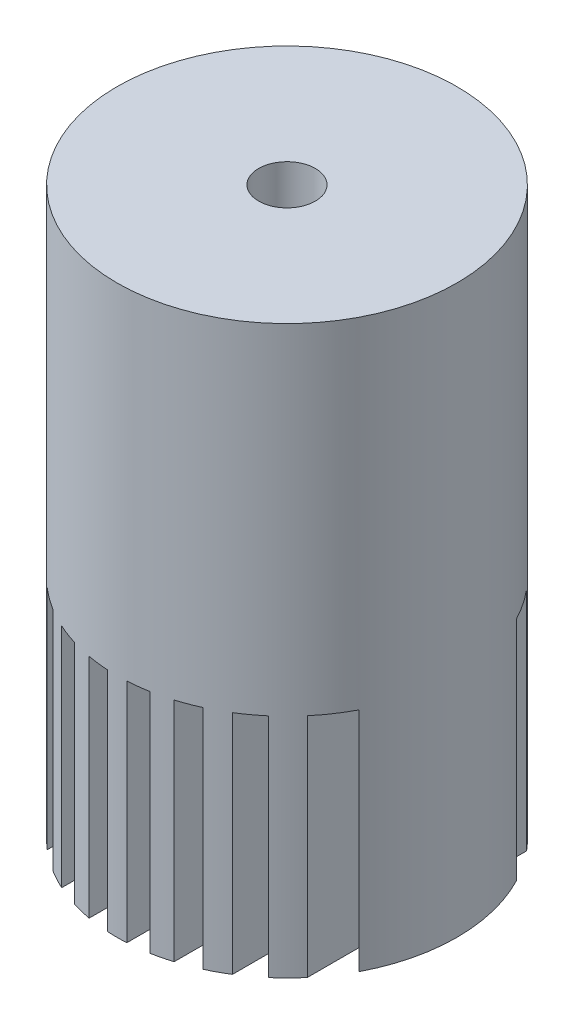
ISO-10303-21;
HEADER;
FILE_DESCRIPTION(('STEP AP214'),'2;1');
FILE_NAME('part.step','',(''),(''),'','','');
FILE_SCHEMA(('AUTOMOTIVE_DESIGN { 1 0 10303 214 1 1 1 1 }'));
ENDSEC;
DATA;
#1=APPLICATION_CONTEXT('core data for automotive mechanical design processes');
#2=APPLICATION_PROTOCOL_DEFINITION('international standard','automotive_design',2000,#1);
#3=PRODUCT_CONTEXT('',#1,'mechanical');
#4=PRODUCT('Part','Part','',(#3));
#5=PRODUCT_RELATED_PRODUCT_CATEGORY('part','',(#4));
#6=PRODUCT_DEFINITION_FORMATION('','',#4);
#7=PRODUCT_DEFINITION_CONTEXT('part definition',#1,'design');
#8=PRODUCT_DEFINITION('design','',#6,#7);
#9=PRODUCT_DEFINITION_SHAPE('','',#8);
#10=(LENGTH_UNIT() NAMED_UNIT(*) SI_UNIT(.MILLI.,.METRE.));
#11=(NAMED_UNIT(*) PLANE_ANGLE_UNIT() SI_UNIT($,.RADIAN.));
#12=(NAMED_UNIT(*) SI_UNIT($,.STERADIAN.) SOLID_ANGLE_UNIT());
#13=UNCERTAINTY_MEASURE_WITH_UNIT(LENGTH_MEASURE(1.E-05),#10,'distance_accuracy_value','');
#14=(GEOMETRIC_REPRESENTATION_CONTEXT(3) GLOBAL_UNCERTAINTY_ASSIGNED_CONTEXT((#13)) GLOBAL_UNIT_ASSIGNED_CONTEXT((#10,
#11,#12)) REPRESENTATION_CONTEXT('',''));
#15=CARTESIAN_POINT('',(0.,0.,0.));
#16=DIRECTION('',(0.,0.,1.));
#17=DIRECTION('',(1.,0.,0.));
#18=AXIS2_PLACEMENT_3D('',#15,#16,#17);
#19=CARTESIAN_POINT('',(0.,-63.5,0.));
#20=DIRECTION('',(0.,1.,0.));
#21=DIRECTION('',(0.,0.,1.));
#22=AXIS2_PLACEMENT_3D('',#19,#20,#21);
#23=PLANE('',#22);
#24=CARTESIAN_POINT('',(0.,-63.5,0.));
#25=DIRECTION('',(0.,1.,0.));
#26=DIRECTION('',(0.,0.,1.));
#27=AXIS2_PLACEMENT_3D('',#24,#25,#26);
#28=CIRCLE('',#27,38.1);
#29=CARTESIAN_POINT('',(33.782,-63.5,17.6177886240016));
#30=VERTEX_POINT('',#29);
#31=CARTESIAN_POINT('',(33.782,-63.5,-17.6177886240016));
#32=VERTEX_POINT('',#31);
#33=EDGE_CURVE('E508',#30,#32,#28,.T.);
#34=ORIENTED_EDGE('',*,*,#33,.F.);
#35=DIRECTION('',(0.,0.,-1.));
#36=VECTOR('',#35,1.);
#37=CARTESIAN_POINT('',(33.782,-63.5,0.));
#38=LINE('',#37,#36);
#39=EDGE_CURVE('E318',#30,#32,#38,.T.);
#40=ORIENTED_EDGE('',*,*,#39,.T.);
#41=EDGE_LOOP('',(#34,#40));
#42=FACE_BOUND('',#41,.T.);
#43=ADVANCED_FACE('F33',(#42),#23,.F.);
#44=CARTESIAN_POINT('',(20.12475,-63.5,-32.3512663961938));
#45=VERTEX_POINT('',#44);
#46=CARTESIAN_POINT('',(15.802,-63.5,-34.6685274564698));
#47=VERTEX_POINT('',#46);
#48=EDGE_CURVE('E513',#45,#47,#28,.T.);
#49=ORIENTED_EDGE('',*,*,#48,.F.);
#50=DIRECTION('',(0.,0.,1.));
#51=VECTOR('',#50,1.);
#52=CARTESIAN_POINT('',(20.12475,-63.5,0.));
#53=LINE('',#52,#51);
#54=CARTESIAN_POINT('',(20.12475,-63.5,32.3512663961938));
#55=VERTEX_POINT('',#54);
#56=EDGE_CURVE('E312',#45,#55,#53,.T.);
#57=ORIENTED_EDGE('',*,*,#56,.T.);
#58=CARTESIAN_POINT('',(15.802,-63.5,34.6685274564698));
#59=VERTEX_POINT('',#58);
#60=EDGE_CURVE('E504',#59,#55,#28,.T.);
#61=ORIENTED_EDGE('',*,*,#60,.F.);
#62=DIRECTION('',(0.,0.,-1.));
#63=VECTOR('',#62,1.);
#64=CARTESIAN_POINT('',(15.802,-63.5,0.));
#65=LINE('',#64,#63);
#66=EDGE_CURVE('E303',#59,#47,#65,.T.);
#67=ORIENTED_EDGE('',*,*,#66,.T.);
#68=EDGE_LOOP('',(#49,#57,#61,#67));
#69=FACE_BOUND('',#68,.T.);
#70=ADVANCED_FACE('F578',(#69),#23,.F.);
#71=CARTESIAN_POINT('',(11.13475,-63.5,-36.4366208976285));
#72=VERTEX_POINT('',#71);
#73=CARTESIAN_POINT('',(6.812,-63.5,-37.4860861654028));
#74=VERTEX_POINT('',#73);
#75=EDGE_CURVE('E516',#72,#74,#28,.T.);
#76=ORIENTED_EDGE('',*,*,#75,.F.);
#77=DIRECTION('',(0.,0.,1.));
#78=VECTOR('',#77,1.);
#79=CARTESIAN_POINT('',(11.13475,-63.5,0.));
#80=LINE('',#79,#78);
#81=CARTESIAN_POINT('',(11.13475,-63.5,36.4366208976285));
#82=VERTEX_POINT('',#81);
#83=EDGE_CURVE('E306',#72,#82,#80,.T.);
#84=ORIENTED_EDGE('',*,*,#83,.T.);
#85=CARTESIAN_POINT('',(6.812,-63.5,37.4860861654028));
#86=VERTEX_POINT('',#85);
#87=EDGE_CURVE('E277',#86,#82,#28,.T.);
#88=ORIENTED_EDGE('',*,*,#87,.F.);
#89=DIRECTION('',(0.,0.,-1.));
#90=VECTOR('',#89,1.);
#91=CARTESIAN_POINT('',(6.812,-63.5,0.));
#92=LINE('',#91,#90);
#93=EDGE_CURVE('E297',#86,#74,#92,.T.);
#94=ORIENTED_EDGE('',*,*,#93,.T.);
#95=EDGE_LOOP('',(#76,#84,#88,#94));
#96=FACE_BOUND('',#95,.T.);
#97=ADVANCED_FACE('F574',(#96),#23,.F.);
#98=CARTESIAN_POINT('',(2.14475,-63.5,-38.0395852689997));
#99=VERTEX_POINT('',#98);
#100=CARTESIAN_POINT('',(-2.178,-63.5,-38.0376959870074));
#101=VERTEX_POINT('',#100);
#102=EDGE_CURVE('E519',#99,#101,#28,.T.);
#103=ORIENTED_EDGE('',*,*,#102,.F.);
#104=DIRECTION('',(0.,0.,1.));
#105=VECTOR('',#104,1.);
#106=CARTESIAN_POINT('',(2.14475,-63.5,0.));
#107=LINE('',#106,#105);
#108=CARTESIAN_POINT('',(2.14475,-63.5,38.0395852689997));
#109=VERTEX_POINT('',#108);
#110=EDGE_CURVE('E300',#99,#109,#107,.T.);
#111=ORIENTED_EDGE('',*,*,#110,.T.);
#112=CARTESIAN_POINT('',(-2.178,-63.5,38.0376959870074));
#113=VERTEX_POINT('',#112);
#114=EDGE_CURVE('E273',#113,#109,#28,.T.);
#115=ORIENTED_EDGE('',*,*,#114,.F.);
#116=DIRECTION('',(0.,0.,-1.));
#117=VECTOR('',#116,1.);
#118=CARTESIAN_POINT('',(-2.178,-63.5,0.));
#119=LINE('',#118,#117);
#120=EDGE_CURVE('E291',#113,#101,#119,.T.);
#121=ORIENTED_EDGE('',*,*,#120,.T.);
#122=EDGE_LOOP('',(#103,#111,#115,#121));
#123=FACE_BOUND('',#122,.T.);
#124=ADVANCED_FACE('F563',(#123),#23,.F.);
#125=CARTESIAN_POINT('',(-6.84525,-63.5,-37.4800287144701));
#126=VERTEX_POINT('',#125);
#127=CARTESIAN_POINT('',(-11.168,-63.5,-36.4264433619315));
#128=VERTEX_POINT('',#127);
#129=EDGE_CURVE('E522',#126,#128,#28,.T.);
#130=ORIENTED_EDGE('',*,*,#129,.F.);
#131=DIRECTION('',(0.,0.,1.));
#132=VECTOR('',#131,1.);
#133=CARTESIAN_POINT('',(-6.84525,-63.5,0.));
#134=LINE('',#133,#132);
#135=CARTESIAN_POINT('',(-6.84525,-63.5,37.4800287144701));
#136=VERTEX_POINT('',#135);
#137=EDGE_CURVE('E294',#126,#136,#134,.T.);
#138=ORIENTED_EDGE('',*,*,#137,.T.);
#139=CARTESIAN_POINT('',(-11.168,-63.5,36.4264433619315));
#140=VERTEX_POINT('',#139);
#141=EDGE_CURVE('E272',#140,#136,#28,.T.);
#142=ORIENTED_EDGE('',*,*,#141,.F.);
#143=DIRECTION('',(0.,0.,-1.));
#144=VECTOR('',#143,1.);
#145=CARTESIAN_POINT('',(-11.168,-63.5,0.));
#146=LINE('',#145,#144);
#147=EDGE_CURVE('E285',#140,#128,#146,.T.);
#148=ORIENTED_EDGE('',*,*,#147,.T.);
#149=EDGE_LOOP('',(#130,#138,#142,#148));
#150=FACE_BOUND('',#149,.T.);
#151=ADVANCED_FACE('F551',(#150),#23,.F.);
#152=CARTESIAN_POINT('',(-15.83525,-63.5,-34.6533527589684));
#153=VERTEX_POINT('',#152);
#154=CARTESIAN_POINT('',(-20.158,-63.5,-32.3305588569081));
#155=VERTEX_POINT('',#154);
#156=EDGE_CURVE('E525',#153,#155,#28,.T.);
#157=ORIENTED_EDGE('',*,*,#156,.F.);
#158=DIRECTION('',(0.,0.,1.));
#159=VECTOR('',#158,1.);
#160=CARTESIAN_POINT('',(-15.83525,-63.5,0.));
#161=LINE('',#160,#159);
#162=CARTESIAN_POINT('',(-15.83525,-63.5,34.6533527589684));
#163=VERTEX_POINT('',#162);
#164=EDGE_CURVE('E288',#153,#163,#161,.T.);
#165=ORIENTED_EDGE('',*,*,#164,.T.);
#166=CARTESIAN_POINT('',(-20.158,-63.5,32.3305588569081));
#167=VERTEX_POINT('',#166);
#168=EDGE_CURVE('E267',#167,#163,#28,.T.);
#169=ORIENTED_EDGE('',*,*,#168,.F.);
#170=DIRECTION('',(0.,0.,-1.));
#171=VECTOR('',#170,1.);
#172=CARTESIAN_POINT('',(-20.158,-63.5,0.));
#173=LINE('',#172,#171);
#174=EDGE_CURVE('E282',#167,#155,#173,.T.);
#175=ORIENTED_EDGE('',*,*,#174,.T.);
#176=EDGE_LOOP('',(#157,#165,#169,#175));
#177=FACE_BOUND('',#176,.T.);
#178=ADVANCED_FACE('F538',(#177),#23,.F.);
#179=CARTESIAN_POINT('',(-24.82525,-63.5,-28.9018505019575));
#180=VERTEX_POINT('',#179);
#181=CARTESIAN_POINT('',(-29.148,-63.5,-24.5357717628772));
#182=VERTEX_POINT('',#181);
#183=EDGE_CURVE('E270',#180,#182,#28,.T.);
#184=ORIENTED_EDGE('',*,*,#183,.F.);
#185=DIRECTION('',(0.,0.,1.));
#186=VECTOR('',#185,1.);
#187=CARTESIAN_POINT('',(-24.82525,-63.5,0.));
#188=LINE('',#187,#186);
#189=CARTESIAN_POINT('',(-24.82525,-63.5,28.9018505019575));
#190=VERTEX_POINT('',#189);
#191=EDGE_CURVE('E265',#180,#190,#188,.T.);
#192=ORIENTED_EDGE('',*,*,#191,.T.);
#193=CARTESIAN_POINT('',(-29.148,-63.5,24.5357717628772));
#194=VERTEX_POINT('',#193);
#195=EDGE_CURVE('E258',#194,#190,#28,.T.);
#196=ORIENTED_EDGE('',*,*,#195,.F.);
#197=DIRECTION('',(0.,0.,-1.));
#198=VECTOR('',#197,1.);
#199=CARTESIAN_POINT('',(-29.148,-63.5,0.));
#200=LINE('',#199,#198);
#201=EDGE_CURVE('E240',#194,#182,#200,.T.);
#202=ORIENTED_EDGE('',*,*,#201,.T.);
#203=EDGE_LOOP('',(#184,#192,#196,#202));
#204=FACE_BOUND('',#203,.T.);
#205=ADVANCED_FACE('F264',(#204),#23,.F.);
#206=CARTESIAN_POINT('',(-33.81525,-63.5,-17.5538846822434));
#207=VERTEX_POINT('',#206);
#208=CARTESIAN_POINT('',(-33.81525,-63.5,17.5538846822434));
#209=VERTEX_POINT('',#208);
#210=EDGE_CURVE('E266',#207,#209,#28,.T.);
#211=ORIENTED_EDGE('',*,*,#210,.F.);
#212=DIRECTION('',(0.,0.,1.));
#213=VECTOR('',#212,1.);
#214=CARTESIAN_POINT('',(-33.81525,-63.5,0.));
#215=LINE('',#214,#213);
#216=EDGE_CURVE('E249',#207,#209,#215,.T.);
#217=ORIENTED_EDGE('',*,*,#216,.T.);
#218=EDGE_LOOP('',(#211,#217));
#219=FACE_BOUND('',#218,.T.);
#220=ADVANCED_FACE('F610',(#219),#23,.F.);
#221=CARTESIAN_POINT('',(0.,63.5,0.));
#222=DIRECTION('',(0.,-1.,0.));
#223=DIRECTION('',(0.,0.,-1.));
#224=AXIS2_PLACEMENT_3D('',#221,#222,#223);
#225=CYLINDRICAL_SURFACE('',#224,38.1);
#226=ORIENTED_EDGE('',*,*,#33,.T.);
#227=DIRECTION('',(0.,-1.,0.));
#228=VECTOR('',#227,1.);
#229=CARTESIAN_POINT('',(33.782,63.5,-17.6177886240016));
#230=LINE('',#229,#228);
#231=CARTESIAN_POINT('',(33.782,-12.7,-17.6177886240016));
#232=VERTEX_POINT('',#231);
#233=EDGE_CURVE('E478',#32,#232,#230,.F.);
#234=ORIENTED_EDGE('',*,*,#233,.T.);
#235=CARTESIAN_POINT('',(0.,-12.7,0.));
#236=DIRECTION('',(0.,-1.,0.));
#237=DIRECTION('',(0.,0.,-1.));
#238=AXIS2_PLACEMENT_3D('',#235,#236,#237);
#239=CIRCLE('',#238,38.1);
#240=CARTESIAN_POINT('',(29.11475,-12.7,-24.5752178512725));
#241=VERTEX_POINT('',#240);
#242=EDGE_CURVE('E11',#241,#232,#239,.T.);
#243=ORIENTED_EDGE('',*,*,#242,.F.);
#244=DIRECTION('',(0.,-1.,0.));
#245=VECTOR('',#244,1.);
#246=CARTESIAN_POINT('',(29.11475,63.5,-24.5752178512725));
#247=LINE('',#246,#245);
#248=CARTESIAN_POINT('',(29.11475,-63.5,-24.5752178512725));
#249=VERTEX_POINT('',#248);
#250=EDGE_CURVE('E475',#241,#249,#247,.T.);
#251=ORIENTED_EDGE('',*,*,#250,.T.);
#252=CARTESIAN_POINT('',(24.792,-63.5,-28.9303773912474));
#253=VERTEX_POINT('',#252);
#254=EDGE_CURVE('E510',#249,#253,#28,.T.);
#255=ORIENTED_EDGE('',*,*,#254,.T.);
#256=DIRECTION('',(0.,-1.,0.));
#257=VECTOR('',#256,1.);
#258=CARTESIAN_POINT('',(24.792,63.5,-28.9303773912474));
#259=LINE('',#258,#257);
#260=CARTESIAN_POINT('',(24.792,-12.7,-28.9303773912474));
#261=VERTEX_POINT('',#260);
#262=EDGE_CURVE('E462',#253,#261,#259,.F.);
#263=ORIENTED_EDGE('',*,*,#262,.T.);
#264=CARTESIAN_POINT('',(0.,-12.7,0.));
#265=DIRECTION('',(0.,1.,0.));
#266=DIRECTION('',(0.,0.,1.));
#267=AXIS2_PLACEMENT_3D('',#264,#265,#266);
#268=CIRCLE('',#267,38.1);
#269=CARTESIAN_POINT('',(20.12475,-12.7,-32.3512663961938));
#270=VERTEX_POINT('',#269);
#271=EDGE_CURVE('E342',#261,#270,#268,.T.);
#272=ORIENTED_EDGE('',*,*,#271,.T.);
#273=DIRECTION('',(0.,-1.,0.));
#274=VECTOR('',#273,1.);
#275=CARTESIAN_POINT('',(20.12475,63.5,-32.3512663961938));
#276=LINE('',#275,#274);
#277=EDGE_CURVE('E470',#270,#45,#276,.T.);
#278=ORIENTED_EDGE('',*,*,#277,.T.);
#279=ORIENTED_EDGE('',*,*,#48,.T.);
#280=DIRECTION('',(0.,-1.,0.));
#281=VECTOR('',#280,1.);
#282=CARTESIAN_POINT('',(15.802,63.5,-34.6685274564698));
#283=LINE('',#282,#281);
#284=CARTESIAN_POINT('',(15.802,-12.7,-34.6685274564698));
#285=VERTEX_POINT('',#284);
#286=EDGE_CURVE('E456',#47,#285,#283,.F.);
#287=ORIENTED_EDGE('',*,*,#286,.T.);
#288=CARTESIAN_POINT('',(0.,-12.7,0.));
#289=DIRECTION('',(0.,1.,0.));
#290=DIRECTION('',(0.,0.,1.));
#291=AXIS2_PLACEMENT_3D('',#288,#289,#290);
#292=CIRCLE('',#291,38.1);
#293=CARTESIAN_POINT('',(11.13475,-12.7,-36.4366208976285));
#294=VERTEX_POINT('',#293);
#295=EDGE_CURVE('E339',#285,#294,#292,.T.);
#296=ORIENTED_EDGE('',*,*,#295,.T.);
#297=DIRECTION('',(0.,-1.,0.));
#298=VECTOR('',#297,1.);
#299=CARTESIAN_POINT('',(11.13475,63.5,-36.4366208976285));
#300=LINE('',#299,#298);
#301=EDGE_CURVE('E367',#294,#72,#300,.T.);
#302=ORIENTED_EDGE('',*,*,#301,.T.);
#303=ORIENTED_EDGE('',*,*,#75,.T.);
#304=DIRECTION('',(0.,-1.,0.));
#305=VECTOR('',#304,1.);
#306=CARTESIAN_POINT('',(6.812,63.5,-37.4860861654028));
#307=LINE('',#306,#305);
#308=CARTESIAN_POINT('',(6.812,-12.7,-37.4860861654028));
#309=VERTEX_POINT('',#308);
#310=EDGE_CURVE('E444',#74,#309,#307,.F.);
#311=ORIENTED_EDGE('',*,*,#310,.T.);
#312=CARTESIAN_POINT('',(0.,-12.7,0.));
#313=DIRECTION('',(0.,1.,0.));
#314=DIRECTION('',(0.,0.,1.));
#315=AXIS2_PLACEMENT_3D('',#312,#313,#314);
#316=CIRCLE('',#315,38.1);
#317=CARTESIAN_POINT('',(2.14475,-12.7,-38.0395852689997));
#318=VERTEX_POINT('',#317);
#319=EDGE_CURVE('E335',#309,#318,#316,.T.);
#320=ORIENTED_EDGE('',*,*,#319,.T.);
#321=DIRECTION('',(0.,-1.,0.));
#322=VECTOR('',#321,1.);
#323=CARTESIAN_POINT('',(2.14475,63.5,-38.0395852689997));
#324=LINE('',#323,#322);
#325=EDGE_CURVE('E453',#318,#99,#324,.T.);
#326=ORIENTED_EDGE('',*,*,#325,.T.);
#327=ORIENTED_EDGE('',*,*,#102,.T.);
#328=DIRECTION('',(0.,-1.,0.));
#329=VECTOR('',#328,1.);
#330=CARTESIAN_POINT('',(-2.178,63.5,-38.0376959870074));
#331=LINE('',#330,#329);
#332=CARTESIAN_POINT('',(-2.178,-12.7,-38.0376959870074));
#333=VERTEX_POINT('',#332);
#334=EDGE_CURVE('E432',#101,#333,#331,.F.);
#335=ORIENTED_EDGE('',*,*,#334,.T.);
#336=CARTESIAN_POINT('',(0.,-12.7,0.));
#337=DIRECTION('',(0.,1.,0.));
#338=DIRECTION('',(0.,0.,1.));
#339=AXIS2_PLACEMENT_3D('',#336,#337,#338);
#340=CIRCLE('',#339,38.1);
#341=CARTESIAN_POINT('',(-6.84525,-12.7,-37.4800287144701));
#342=VERTEX_POINT('',#341);
#343=EDGE_CURVE('E334',#333,#342,#340,.T.);
#344=ORIENTED_EDGE('',*,*,#343,.T.);
#345=DIRECTION('',(0.,-1.,0.));
#346=VECTOR('',#345,1.);
#347=CARTESIAN_POINT('',(-6.84525,63.5,-37.4800287144701));
#348=LINE('',#347,#346);
#349=EDGE_CURVE('E441',#342,#126,#348,.T.);
#350=ORIENTED_EDGE('',*,*,#349,.T.);
#351=ORIENTED_EDGE('',*,*,#129,.T.);
#352=DIRECTION('',(0.,-1.,0.));
#353=VECTOR('',#352,1.);
#354=CARTESIAN_POINT('',(-11.168,63.5,-36.4264433619315));
#355=LINE('',#354,#353);
#356=CARTESIAN_POINT('',(-11.168,-12.7,-36.4264433619315));
#357=VERTEX_POINT('',#356);
#358=EDGE_CURVE('E420',#128,#357,#355,.F.);
#359=ORIENTED_EDGE('',*,*,#358,.T.);
#360=CARTESIAN_POINT('',(0.,-12.7,0.));
#361=DIRECTION('',(0.,1.,0.));
#362=DIRECTION('',(0.,0.,1.));
#363=AXIS2_PLACEMENT_3D('',#360,#361,#362);
#364=CIRCLE('',#363,38.1);
#365=CARTESIAN_POINT('',(-15.83525,-12.7,-34.6533527589684));
#366=VERTEX_POINT('',#365);
#367=EDGE_CURVE('E330',#357,#366,#364,.T.);
#368=ORIENTED_EDGE('',*,*,#367,.T.);
#369=DIRECTION('',(0.,-1.,0.));
#370=VECTOR('',#369,1.);
#371=CARTESIAN_POINT('',(-15.83525,63.5,-34.6533527589684));
#372=LINE('',#371,#370);
#373=EDGE_CURVE('E429',#366,#153,#372,.T.);
#374=ORIENTED_EDGE('',*,*,#373,.T.);
#375=ORIENTED_EDGE('',*,*,#156,.T.);
#376=DIRECTION('',(0.,-1.,0.));
#377=VECTOR('',#376,1.);
#378=CARTESIAN_POINT('',(-20.158,63.5,-32.3305588569081));
#379=LINE('',#378,#377);
#380=CARTESIAN_POINT('',(-20.158,-12.7,-32.3305588569081));
#381=VERTEX_POINT('',#380);
#382=EDGE_CURVE('E56',#155,#381,#379,.F.);
#383=ORIENTED_EDGE('',*,*,#382,.T.);
#384=CARTESIAN_POINT('',(0.,-12.7,0.));
#385=DIRECTION('',(0.,1.,0.));
#386=DIRECTION('',(0.,0.,1.));
#387=AXIS2_PLACEMENT_3D('',#384,#385,#386);
#388=CIRCLE('',#387,38.1);
#389=CARTESIAN_POINT('',(-24.82525,-12.7,-28.9018505019575));
#390=VERTEX_POINT('',#389);
#391=EDGE_CURVE('E326',#381,#390,#388,.T.);
#392=ORIENTED_EDGE('',*,*,#391,.T.);
#393=DIRECTION('',(0.,-1.,0.));
#394=VECTOR('',#393,1.);
#395=CARTESIAN_POINT('',(-24.82525,63.5,-28.9018505019575));
#396=LINE('',#395,#394);
#397=EDGE_CURVE('E417',#390,#180,#396,.T.);
#398=ORIENTED_EDGE('',*,*,#397,.T.);
#399=ORIENTED_EDGE('',*,*,#183,.T.);
#400=DIRECTION('',(0.,-1.,0.));
#401=VECTOR('',#400,1.);
#402=CARTESIAN_POINT('',(-29.148,63.5,-24.5357717628772));
#403=LINE('',#402,#401);
#404=CARTESIAN_POINT('',(-29.148,-12.7,-24.5357717628772));
#405=VERTEX_POINT('',#404);
#406=EDGE_CURVE('E48',#182,#405,#403,.F.);
#407=ORIENTED_EDGE('',*,*,#406,.T.);
#408=CARTESIAN_POINT('',(0.,-12.7,0.));
#409=DIRECTION('',(0.,1.,0.));
#410=DIRECTION('',(0.,0.,1.));
#411=AXIS2_PLACEMENT_3D('',#408,#409,#410);
#412=CIRCLE('',#411,38.1);
#413=CARTESIAN_POINT('',(-33.81525,-12.7,-17.5538846822434));
#414=VERTEX_POINT('',#413);
#415=EDGE_CURVE('E322',#405,#414,#412,.T.);
#416=ORIENTED_EDGE('',*,*,#415,.T.);
#417=DIRECTION('',(0.,-1.,0.));
#418=VECTOR('',#417,1.);
#419=CARTESIAN_POINT('',(-33.81525,63.5,-17.5538846822434));
#420=LINE('',#419,#418);
#421=EDGE_CURVE('E408',#414,#207,#420,.T.);
#422=ORIENTED_EDGE('',*,*,#421,.T.);
#423=ORIENTED_EDGE('',*,*,#210,.T.);
#424=DIRECTION('',(0.,-1.,0.));
#425=VECTOR('',#424,1.);
#426=CARTESIAN_POINT('',(-33.81525,63.5,17.5538846822434));
#427=LINE('',#426,#425);
#428=CARTESIAN_POINT('',(-33.81525,-12.7,17.5538846822434));
#429=VERTEX_POINT('',#428);
#430=EDGE_CURVE('E261',#209,#429,#427,.F.);
#431=ORIENTED_EDGE('',*,*,#430,.T.);
#432=CARTESIAN_POINT('',(-29.148,-12.7,24.5357717628772));
#433=VERTEX_POINT('',#432);
#434=EDGE_CURVE('E260',#429,#433,#412,.T.);
#435=ORIENTED_EDGE('',*,*,#434,.T.);
#436=DIRECTION('',(0.,-1.,0.));
#437=VECTOR('',#436,1.);
#438=CARTESIAN_POINT('',(-29.148,63.5,24.5357717628772));
#439=LINE('',#438,#437);
#440=EDGE_CURVE('E243',#433,#194,#439,.T.);
#441=ORIENTED_EDGE('',*,*,#440,.T.);
#442=ORIENTED_EDGE('',*,*,#195,.T.);
#443=DIRECTION('',(0.,-1.,0.));
#444=VECTOR('',#443,1.);
#445=CARTESIAN_POINT('',(-24.82525,63.5,28.9018505019575));
#446=LINE('',#445,#444);
#447=CARTESIAN_POINT('',(-24.82525,-12.7,28.9018505019575));
#448=VERTEX_POINT('',#447);
#449=EDGE_CURVE('E415',#190,#448,#446,.F.);
#450=ORIENTED_EDGE('',*,*,#449,.T.);
#451=CARTESIAN_POINT('',(-20.158,-12.7,32.3305588569081));
#452=VERTEX_POINT('',#451);
#453=EDGE_CURVE('E323',#448,#452,#388,.T.);
#454=ORIENTED_EDGE('',*,*,#453,.T.);
#455=DIRECTION('',(0.,-1.,0.));
#456=VECTOR('',#455,1.);
#457=CARTESIAN_POINT('',(-20.158,63.5,32.3305588569081));
#458=LINE('',#457,#456);
#459=EDGE_CURVE('E412',#452,#167,#458,.T.);
#460=ORIENTED_EDGE('',*,*,#459,.T.);
#461=ORIENTED_EDGE('',*,*,#168,.T.);
#462=DIRECTION('',(0.,-1.,0.));
#463=VECTOR('',#462,1.);
#464=CARTESIAN_POINT('',(-15.83525,63.5,34.6533527589684));
#465=LINE('',#464,#463);
#466=CARTESIAN_POINT('',(-15.83525,-12.7,34.6533527589684));
#467=VERTEX_POINT('',#466);
#468=EDGE_CURVE('E426',#163,#467,#465,.F.);
#469=ORIENTED_EDGE('',*,*,#468,.T.);
#470=CARTESIAN_POINT('',(-11.168,-12.7,36.4264433619315));
#471=VERTEX_POINT('',#470);
#472=EDGE_CURVE('E327',#467,#471,#364,.T.);
#473=ORIENTED_EDGE('',*,*,#472,.T.);
#474=DIRECTION('',(0.,-1.,0.));
#475=VECTOR('',#474,1.);
#476=CARTESIAN_POINT('',(-11.168,63.5,36.4264433619315));
#477=LINE('',#476,#475);
#478=EDGE_CURVE('E423',#471,#140,#477,.T.);
#479=ORIENTED_EDGE('',*,*,#478,.T.);
#480=ORIENTED_EDGE('',*,*,#141,.T.);
#481=DIRECTION('',(0.,-1.,0.));
#482=VECTOR('',#481,1.);
#483=CARTESIAN_POINT('',(-6.84525,63.5,37.4800287144701));
#484=LINE('',#483,#482);
#485=CARTESIAN_POINT('',(-6.84525,-12.7,37.4800287144701));
#486=VERTEX_POINT('',#485);
#487=EDGE_CURVE('E438',#136,#486,#484,.F.);
#488=ORIENTED_EDGE('',*,*,#487,.T.);
#489=CARTESIAN_POINT('',(-2.178,-12.7,38.0376959870074));
#490=VERTEX_POINT('',#489);
#491=EDGE_CURVE('E331',#486,#490,#340,.T.);
#492=ORIENTED_EDGE('',*,*,#491,.T.);
#493=DIRECTION('',(0.,-1.,0.));
#494=VECTOR('',#493,1.);
#495=CARTESIAN_POINT('',(-2.178,63.5,38.0376959870074));
#496=LINE('',#495,#494);
#497=EDGE_CURVE('E435',#490,#113,#496,.T.);
#498=ORIENTED_EDGE('',*,*,#497,.T.);
#499=ORIENTED_EDGE('',*,*,#114,.T.);
#500=DIRECTION('',(0.,-1.,0.));
#501=VECTOR('',#500,1.);
#502=CARTESIAN_POINT('',(2.14475,63.5,38.0395852689997));
#503=LINE('',#502,#501);
#504=CARTESIAN_POINT('',(2.14475,-12.7,38.0395852689997));
#505=VERTEX_POINT('',#504);
#506=EDGE_CURVE('E450',#109,#505,#503,.F.);
#507=ORIENTED_EDGE('',*,*,#506,.T.);
#508=CARTESIAN_POINT('',(6.812,-12.7,37.4860861654028));
#509=VERTEX_POINT('',#508);
#510=EDGE_CURVE('E338',#505,#509,#316,.T.);
#511=ORIENTED_EDGE('',*,*,#510,.T.);
#512=DIRECTION('',(0.,-1.,0.));
#513=VECTOR('',#512,1.);
#514=CARTESIAN_POINT('',(6.812,63.5,37.4860861654028));
#515=LINE('',#514,#513);
#516=EDGE_CURVE('E447',#509,#86,#515,.T.);
#517=ORIENTED_EDGE('',*,*,#516,.T.);
#518=ORIENTED_EDGE('',*,*,#87,.T.);
#519=DIRECTION('',(0.,-1.,0.));
#520=VECTOR('',#519,1.);
#521=CARTESIAN_POINT('',(11.13475,63.5,36.4366208976285));
#522=LINE('',#521,#520);
#523=CARTESIAN_POINT('',(11.13475,-12.7,36.4366208976285));
#524=VERTEX_POINT('',#523);
#525=EDGE_CURVE('E355',#82,#524,#522,.F.);
#526=ORIENTED_EDGE('',*,*,#525,.T.);
#527=CARTESIAN_POINT('',(15.802,-12.7,34.6685274564698));
#528=VERTEX_POINT('',#527);
#529=EDGE_CURVE('E341',#524,#528,#292,.T.);
#530=ORIENTED_EDGE('',*,*,#529,.T.);
#531=DIRECTION('',(0.,-1.,0.));
#532=VECTOR('',#531,1.);
#533=CARTESIAN_POINT('',(15.802,63.5,34.6685274564698));
#534=LINE('',#533,#532);
#535=EDGE_CURVE('E352',#528,#59,#534,.T.);
#536=ORIENTED_EDGE('',*,*,#535,.T.);
#537=ORIENTED_EDGE('',*,*,#60,.T.);
#538=DIRECTION('',(0.,-1.,0.));
#539=VECTOR('',#538,1.);
#540=CARTESIAN_POINT('',(20.12475,63.5,32.3512663961938));
#541=LINE('',#540,#539);
#542=CARTESIAN_POINT('',(20.12475,-12.7,32.3512663961938));
#543=VERTEX_POINT('',#542);
#544=EDGE_CURVE('E467',#55,#543,#541,.F.);
#545=ORIENTED_EDGE('',*,*,#544,.T.);
#546=CARTESIAN_POINT('',(24.792,-12.7,28.9303773912474));
#547=VERTEX_POINT('',#546);
#548=EDGE_CURVE('E344',#543,#547,#268,.T.);
#549=ORIENTED_EDGE('',*,*,#548,.T.);
#550=DIRECTION('',(0.,-1.,0.));
#551=VECTOR('',#550,1.);
#552=CARTESIAN_POINT('',(24.792,63.5,28.9303773912474));
#553=LINE('',#552,#551);
#554=CARTESIAN_POINT('',(24.792,-63.5,28.9303773912474));
#555=VERTEX_POINT('',#554);
#556=EDGE_CURVE('E464',#547,#555,#553,.T.);
#557=ORIENTED_EDGE('',*,*,#556,.T.);
#558=CARTESIAN_POINT('',(29.11475,-63.5,24.5752178512725));
#559=VERTEX_POINT('',#558);
#560=EDGE_CURVE('E506',#555,#559,#28,.T.);
#561=ORIENTED_EDGE('',*,*,#560,.T.);
#562=DIRECTION('',(0.,-1.,0.));
#563=VECTOR('',#562,1.);
#564=CARTESIAN_POINT('',(29.11475,63.5,24.5752178512725));
#565=LINE('',#564,#563);
#566=CARTESIAN_POINT('',(29.11475,-12.7,24.5752178512725));
#567=VERTEX_POINT('',#566);
#568=EDGE_CURVE('E472',#559,#567,#565,.F.);
#569=ORIENTED_EDGE('',*,*,#568,.T.);
#570=CARTESIAN_POINT('',(33.782,-12.7,17.6177886240016));
#571=VERTEX_POINT('',#570);
#572=EDGE_CURVE('E37',#571,#567,#239,.T.);
#573=ORIENTED_EDGE('',*,*,#572,.F.);
#574=DIRECTION('',(0.,-1.,0.));
#575=VECTOR('',#574,1.);
#576=CARTESIAN_POINT('',(33.782,63.5,17.6177886240016));
#577=LINE('',#576,#575);
#578=EDGE_CURVE('E481',#571,#30,#577,.T.);
#579=ORIENTED_EDGE('',*,*,#578,.T.);
#580=EDGE_LOOP('',(#226,#234,#243,#251,#255,#263,#272,#278,#279,#287,#296,#302,#303,#311,#320,
#326,#327,#335,#344,#350,#351,#359,#368,#374,#375,#383,#392,#398,#399,#407,#416,#422,#423,#431,
#435,#441,#442,#450,#454,#460,#461,#469,#473,#479,#480,#488,#492,#498,#499,#507,#511,#517,#518,
#526,#530,#536,#537,#545,#549,#557,#561,#569,#573,#579));
#581=FACE_BOUND('',#580,.T.);
#582=CARTESIAN_POINT('',(0.,63.5,0.));
#583=DIRECTION('',(0.,1.,0.));
#584=DIRECTION('',(0.,0.,1.));
#585=AXIS2_PLACEMENT_3D('',#582,#583,#584);
#586=CIRCLE('',#585,38.1);
#587=CARTESIAN_POINT('',(0.,63.5,38.1));
#588=VERTEX_POINT('',#587);
#589=EDGE_CURVE('E250',#588,#588,#586,.T.);
#590=ORIENTED_EDGE('',*,*,#589,.F.);
#591=EDGE_LOOP('',(#590));
#592=FACE_BOUND('',#591,.T.);
#593=ADVANCED_FACE('F35',(#581,#592),#225,.T.);
#594=CARTESIAN_POINT('',(0.,63.5,0.));
#595=DIRECTION('',(0.,1.,0.));
#596=DIRECTION('',(0.,0.,1.));
#597=AXIS2_PLACEMENT_3D('',#594,#595,#596);
#598=PLANE('',#597);
#599=CARTESIAN_POINT('',(0.,63.5,0.));
#600=DIRECTION('',(0.,1.,0.));
#601=DIRECTION('',(0.,0.,1.));
#602=AXIS2_PLACEMENT_3D('',#599,#600,#601);
#603=CIRCLE('',#602,6.35);
#604=CARTESIAN_POINT('',(0.,63.5,6.35));
#605=VERTEX_POINT('',#604);
#606=EDGE_CURVE('E276',#605,#605,#603,.T.);
#607=ORIENTED_EDGE('',*,*,#606,.F.);
#608=EDGE_LOOP('',(#607));
#609=FACE_BOUND('',#608,.T.);
#610=ORIENTED_EDGE('',*,*,#589,.T.);
#611=EDGE_LOOP('',(#610));
#612=FACE_BOUND('',#611,.T.);
#613=ADVANCED_FACE('F497',(#609,#612),#598,.T.);
#614=ORIENTED_EDGE('',*,*,#254,.F.);
#615=DIRECTION('',(0.,0.,1.));
#616=VECTOR('',#615,1.);
#617=CARTESIAN_POINT('',(29.11475,-63.5,0.));
#618=LINE('',#617,#616);
#619=EDGE_CURVE('E315',#249,#559,#618,.T.);
#620=ORIENTED_EDGE('',*,*,#619,.T.);
#621=ORIENTED_EDGE('',*,*,#560,.F.);
#622=DIRECTION('',(0.,0.,-1.));
#623=VECTOR('',#622,1.);
#624=CARTESIAN_POINT('',(24.792,-63.5,0.));
#625=LINE('',#624,#623);
#626=EDGE_CURVE('E309',#555,#253,#625,.T.);
#627=ORIENTED_EDGE('',*,*,#626,.T.);
#628=EDGE_LOOP('',(#614,#620,#621,#627));
#629=FACE_BOUND('',#628,.T.);
#630=ADVANCED_FACE('F500',(#629),#23,.F.);
#631=CARTESIAN_POINT('',(0.,45.72,0.));
#632=DIRECTION('',(0.,1.,0.));
#633=DIRECTION('',(0.,0.,1.));
#634=AXIS2_PLACEMENT_3D('',#631,#632,#633);
#635=CYLINDRICAL_SURFACE('',#634,6.35);
#636=CARTESIAN_POINT('',(0.,45.72,0.));
#637=DIRECTION('',(0.,1.,0.));
#638=DIRECTION('',(0.,0.,1.));
#639=AXIS2_PLACEMENT_3D('',#636,#637,#638);
#640=CIRCLE('',#639,6.35);
#641=CARTESIAN_POINT('',(0.,45.72,6.35));
#642=VERTEX_POINT('',#641);
#643=EDGE_CURVE('E488',#642,#642,#640,.T.);
#644=ORIENTED_EDGE('',*,*,#643,.F.);
#645=EDGE_LOOP('',(#644));
#646=FACE_BOUND('',#645,.T.);
#647=ORIENTED_EDGE('',*,*,#606,.T.);
#648=EDGE_LOOP('',(#647));
#649=FACE_BOUND('',#648,.T.);
#650=ADVANCED_FACE('F495',(#646,#649),#635,.F.);
#651=CARTESIAN_POINT('',(0.,-5.07999999999999,0.));
#652=DIRECTION('',(0.,1.,0.));
#653=DIRECTION('',(0.,0.,1.));
#654=AXIS2_PLACEMENT_3D('',#651,#652,#653);
#655=CYLINDRICAL_SURFACE('',#654,25.4);
#656=CARTESIAN_POINT('',(0.,-5.07999999999999,0.));
#657=DIRECTION('',(0.,1.,0.));
#658=DIRECTION('',(0.,0.,1.));
#659=AXIS2_PLACEMENT_3D('',#656,#657,#658);
#660=CIRCLE('',#659,25.4);
#661=CARTESIAN_POINT('',(0.,-5.07999999999999,25.4));
#662=VERTEX_POINT('',#661);
#663=EDGE_CURVE('E485',#662,#662,#660,.T.);
#664=ORIENTED_EDGE('',*,*,#663,.F.);
#665=EDGE_LOOP('',(#664));
#666=FACE_BOUND('',#665,.T.);
#667=CARTESIAN_POINT('',(0.,45.72,0.));
#668=DIRECTION('',(0.,1.,0.));
#669=DIRECTION('',(0.,0.,1.));
#670=AXIS2_PLACEMENT_3D('',#667,#668,#669);
#671=CIRCLE('',#670,25.4);
#672=CARTESIAN_POINT('',(0.,45.72,25.4));
#673=VERTEX_POINT('',#672);
#674=EDGE_CURVE('E484',#673,#673,#671,.T.);
#675=ORIENTED_EDGE('',*,*,#674,.T.);
#676=EDGE_LOOP('',(#675));
#677=FACE_BOUND('',#676,.T.);
#678=ADVANCED_FACE('F614',(#666,#677),#655,.F.);
#679=CARTESIAN_POINT('',(0.,-5.07999999999999,0.));
#680=DIRECTION('',(0.,1.,0.));
#681=DIRECTION('',(0.,0.,1.));
#682=AXIS2_PLACEMENT_3D('',#679,#680,#681);
#683=PLANE('',#682);
#684=ORIENTED_EDGE('',*,*,#663,.T.);
#685=EDGE_LOOP('',(#684));
#686=FACE_BOUND('',#685,.T.);
#687=ADVANCED_FACE('F637',(#686),#683,.T.);
#688=CARTESIAN_POINT('',(0.,45.72,0.));
#689=DIRECTION('',(0.,1.,0.));
#690=DIRECTION('',(0.,0.,1.));
#691=AXIS2_PLACEMENT_3D('',#688,#689,#690);
#692=PLANE('',#691);
#693=ORIENTED_EDGE('',*,*,#643,.T.);
#694=EDGE_LOOP('',(#693));
#695=FACE_BOUND('',#694,.T.);
#696=ORIENTED_EDGE('',*,*,#674,.F.);
#697=EDGE_LOOP('',(#696));
#698=FACE_BOUND('',#697,.T.);
#699=ADVANCED_FACE('F630',(#695,#698),#692,.F.);
#700=CARTESIAN_POINT('',(0.,-12.7,0.));
#701=DIRECTION('',(0.,1.,0.));
#702=DIRECTION('',(0.,0.,1.));
#703=AXIS2_PLACEMENT_3D('',#700,#701,#702);
#704=PLANE('',#703);
#705=DIRECTION('',(0.,0.,1.));
#706=VECTOR('',#705,1.);
#707=CARTESIAN_POINT('',(-29.148,-12.7,-38.1000000000005));
#708=LINE('',#707,#706);
#709=EDGE_CURVE('E401',#405,#433,#708,.T.);
#710=ORIENTED_EDGE('',*,*,#709,.T.);
#711=ORIENTED_EDGE('',*,*,#434,.F.);
#712=DIRECTION('',(0.,0.,-1.));
#713=VECTOR('',#712,1.);
#714=CARTESIAN_POINT('',(-33.81525,-12.7,-38.1000000000005));
#715=LINE('',#714,#713);
#716=EDGE_CURVE('E398',#429,#414,#715,.T.);
#717=ORIENTED_EDGE('',*,*,#716,.T.);
#718=ORIENTED_EDGE('',*,*,#415,.F.);
#719=EDGE_LOOP('',(#710,#711,#717,#718));
#720=FACE_BOUND('',#719,.T.);
#721=ADVANCED_FACE('F628',(#720),#704,.F.);
#722=CARTESIAN_POINT('',(-33.81525,-12.7,-38.1000000000005));
#723=DIRECTION('',(-1.,0.,0.));
#724=DIRECTION('',(0.,0.,1.));
#725=AXIS2_PLACEMENT_3D('',#722,#723,#724);
#726=PLANE('',#725);
#727=ORIENTED_EDGE('',*,*,#716,.F.);
#728=ORIENTED_EDGE('',*,*,#430,.F.);
#729=ORIENTED_EDGE('',*,*,#216,.F.);
#730=ORIENTED_EDGE('',*,*,#421,.F.);
#731=EDGE_LOOP('',(#727,#728,#729,#730));
#732=FACE_BOUND('',#731,.T.);
#733=ADVANCED_FACE('F626',(#732),#726,.F.);
#734=CARTESIAN_POINT('',(-29.148,-12.7,-38.1000000000005));
#735=DIRECTION('',(1.,0.,0.));
#736=DIRECTION('',(0.,0.,-1.));
#737=AXIS2_PLACEMENT_3D('',#734,#735,#736);
#738=PLANE('',#737);
#739=ORIENTED_EDGE('',*,*,#709,.F.);
#740=ORIENTED_EDGE('',*,*,#406,.F.);
#741=ORIENTED_EDGE('',*,*,#201,.F.);
#742=ORIENTED_EDGE('',*,*,#440,.F.);
#743=EDGE_LOOP('',(#739,#740,#741,#742));
#744=FACE_BOUND('',#743,.T.);
#745=ADVANCED_FACE('F242',(#744),#738,.F.);
#746=CARTESIAN_POINT('',(0.,-12.7,0.));
#747=DIRECTION('',(0.,1.,0.));
#748=DIRECTION('',(0.,0.,1.));
#749=AXIS2_PLACEMENT_3D('',#746,#747,#748);
#750=PLANE('',#749);
#751=DIRECTION('',(0.,0.,1.));
#752=VECTOR('',#751,1.);
#753=CARTESIAN_POINT('',(-20.158,-12.7,-38.1000000000004));
#754=LINE('',#753,#752);
#755=EDGE_CURVE('E395',#381,#452,#754,.T.);
#756=ORIENTED_EDGE('',*,*,#755,.T.);
#757=ORIENTED_EDGE('',*,*,#453,.F.);
#758=DIRECTION('',(0.,0.,-1.));
#759=VECTOR('',#758,1.);
#760=CARTESIAN_POINT('',(-24.82525,-12.7,-38.1000000000004));
#761=LINE('',#760,#759);
#762=EDGE_CURVE('E392',#448,#390,#761,.T.);
#763=ORIENTED_EDGE('',*,*,#762,.T.);
#764=ORIENTED_EDGE('',*,*,#391,.F.);
#765=EDGE_LOOP('',(#756,#757,#763,#764));
#766=FACE_BOUND('',#765,.T.);
#767=ADVANCED_FACE('F535',(#766),#750,.F.);
#768=CARTESIAN_POINT('',(-24.82525,-12.7,-38.1000000000004));
#769=DIRECTION('',(-1.,0.,0.));
#770=DIRECTION('',(0.,0.,1.));
#771=AXIS2_PLACEMENT_3D('',#768,#769,#770);
#772=PLANE('',#771);
#773=ORIENTED_EDGE('',*,*,#762,.F.);
#774=ORIENTED_EDGE('',*,*,#449,.F.);
#775=ORIENTED_EDGE('',*,*,#191,.F.);
#776=ORIENTED_EDGE('',*,*,#397,.F.);
#777=EDGE_LOOP('',(#773,#774,#775,#776));
#778=FACE_BOUND('',#777,.T.);
#779=ADVANCED_FACE('F533',(#778),#772,.F.);
#780=CARTESIAN_POINT('',(-20.158,-12.7,-38.1000000000004));
#781=DIRECTION('',(1.,0.,0.));
#782=DIRECTION('',(0.,0.,-1.));
#783=AXIS2_PLACEMENT_3D('',#780,#781,#782);
#784=PLANE('',#783);
#785=ORIENTED_EDGE('',*,*,#755,.F.);
#786=ORIENTED_EDGE('',*,*,#382,.F.);
#787=ORIENTED_EDGE('',*,*,#174,.F.);
#788=ORIENTED_EDGE('',*,*,#459,.F.);
#789=EDGE_LOOP('',(#785,#786,#787,#788));
#790=FACE_BOUND('',#789,.T.);
#791=ADVANCED_FACE('F641',(#790),#784,.F.);
#792=CARTESIAN_POINT('',(0.,-12.7,0.));
#793=DIRECTION('',(0.,1.,0.));
#794=DIRECTION('',(0.,0.,1.));
#795=AXIS2_PLACEMENT_3D('',#792,#793,#794);
#796=PLANE('',#795);
#797=DIRECTION('',(0.,0.,1.));
#798=VECTOR('',#797,1.);
#799=CARTESIAN_POINT('',(-11.168,-12.7,-38.1000000000003));
#800=LINE('',#799,#798);
#801=EDGE_CURVE('E389',#357,#471,#800,.T.);
#802=ORIENTED_EDGE('',*,*,#801,.T.);
#803=ORIENTED_EDGE('',*,*,#472,.F.);
#804=DIRECTION('',(0.,0.,-1.));
#805=VECTOR('',#804,1.);
#806=CARTESIAN_POINT('',(-15.83525,-12.7,-38.1000000000003));
#807=LINE('',#806,#805);
#808=EDGE_CURVE('E386',#467,#366,#807,.T.);
#809=ORIENTED_EDGE('',*,*,#808,.T.);
#810=ORIENTED_EDGE('',*,*,#367,.F.);
#811=EDGE_LOOP('',(#802,#803,#809,#810));
#812=FACE_BOUND('',#811,.T.);
#813=ADVANCED_FACE('F545',(#812),#796,.F.);
#814=CARTESIAN_POINT('',(-15.83525,-12.7,-38.1000000000003));
#815=DIRECTION('',(-1.,0.,0.));
#816=DIRECTION('',(0.,0.,1.));
#817=AXIS2_PLACEMENT_3D('',#814,#815,#816);
#818=PLANE('',#817);
#819=ORIENTED_EDGE('',*,*,#808,.F.);
#820=ORIENTED_EDGE('',*,*,#468,.F.);
#821=ORIENTED_EDGE('',*,*,#164,.F.);
#822=ORIENTED_EDGE('',*,*,#373,.F.);
#823=EDGE_LOOP('',(#819,#820,#821,#822));
#824=FACE_BOUND('',#823,.T.);
#825=ADVANCED_FACE('F541',(#824),#818,.F.);
#826=CARTESIAN_POINT('',(-11.168,-12.7,-38.1000000000003));
#827=DIRECTION('',(1.,0.,0.));
#828=DIRECTION('',(0.,0.,-1.));
#829=AXIS2_PLACEMENT_3D('',#826,#827,#828);
#830=PLANE('',#829);
#831=ORIENTED_EDGE('',*,*,#801,.F.);
#832=ORIENTED_EDGE('',*,*,#358,.F.);
#833=ORIENTED_EDGE('',*,*,#147,.F.);
#834=ORIENTED_EDGE('',*,*,#478,.F.);
#835=EDGE_LOOP('',(#831,#832,#833,#834));
#836=FACE_BOUND('',#835,.T.);
#837=ADVANCED_FACE('F547',(#836),#830,.F.);
#838=CARTESIAN_POINT('',(0.,-12.7,0.));
#839=DIRECTION('',(0.,1.,0.));
#840=DIRECTION('',(0.,0.,1.));
#841=AXIS2_PLACEMENT_3D('',#838,#839,#840);
#842=PLANE('',#841);
#843=DIRECTION('',(0.,0.,1.));
#844=VECTOR('',#843,1.);
#845=CARTESIAN_POINT('',(-2.178,-12.7,-38.1000000000003));
#846=LINE('',#845,#844);
#847=EDGE_CURVE('E383',#333,#490,#846,.T.);
#848=ORIENTED_EDGE('',*,*,#847,.T.);
#849=ORIENTED_EDGE('',*,*,#491,.F.);
#850=DIRECTION('',(0.,0.,-1.));
#851=VECTOR('',#850,1.);
#852=CARTESIAN_POINT('',(-6.84525,-12.7,-38.1000000000003));
#853=LINE('',#852,#851);
#854=EDGE_CURVE('E380',#486,#342,#853,.T.);
#855=ORIENTED_EDGE('',*,*,#854,.T.);
#856=ORIENTED_EDGE('',*,*,#343,.F.);
#857=EDGE_LOOP('',(#848,#849,#855,#856));
#858=FACE_BOUND('',#857,.T.);
#859=ADVANCED_FACE('F558',(#858),#842,.F.);
#860=CARTESIAN_POINT('',(-6.84525,-12.7,-38.1000000000003));
#861=DIRECTION('',(-1.,0.,0.));
#862=DIRECTION('',(0.,0.,1.));
#863=AXIS2_PLACEMENT_3D('',#860,#861,#862);
#864=PLANE('',#863);
#865=ORIENTED_EDGE('',*,*,#854,.F.);
#866=ORIENTED_EDGE('',*,*,#487,.F.);
#867=ORIENTED_EDGE('',*,*,#137,.F.);
#868=ORIENTED_EDGE('',*,*,#349,.F.);
#869=EDGE_LOOP('',(#865,#866,#867,#868));
#870=FACE_BOUND('',#869,.T.);
#871=ADVANCED_FACE('F554',(#870),#864,.F.);
#872=CARTESIAN_POINT('',(-2.178,-12.7,-38.1000000000003));
#873=DIRECTION('',(1.,0.,0.));
#874=DIRECTION('',(0.,0.,-1.));
#875=AXIS2_PLACEMENT_3D('',#872,#873,#874);
#876=PLANE('',#875);
#877=ORIENTED_EDGE('',*,*,#847,.F.);
#878=ORIENTED_EDGE('',*,*,#334,.F.);
#879=ORIENTED_EDGE('',*,*,#120,.F.);
#880=ORIENTED_EDGE('',*,*,#497,.F.);
#881=EDGE_LOOP('',(#877,#878,#879,#880));
#882=FACE_BOUND('',#881,.T.);
#883=ADVANCED_FACE('F560',(#882),#876,.F.);
#884=CARTESIAN_POINT('',(0.,-12.7,0.));
#885=DIRECTION('',(0.,1.,0.));
#886=DIRECTION('',(0.,0.,1.));
#887=AXIS2_PLACEMENT_3D('',#884,#885,#886);
#888=PLANE('',#887);
#889=DIRECTION('',(0.,0.,-1.));
#890=VECTOR('',#889,1.);
#891=CARTESIAN_POINT('',(2.14475,-12.7,-38.1000000000002));
#892=LINE('',#891,#890);
#893=EDGE_CURVE('E373',#505,#318,#892,.T.);
#894=ORIENTED_EDGE('',*,*,#893,.T.);
#895=ORIENTED_EDGE('',*,*,#319,.F.);
#896=DIRECTION('',(0.,0.,1.));
#897=VECTOR('',#896,1.);
#898=CARTESIAN_POINT('',(6.812,-12.7,-38.1000000000002));
#899=LINE('',#898,#897);
#900=EDGE_CURVE('E377',#309,#509,#899,.T.);
#901=ORIENTED_EDGE('',*,*,#900,.T.);
#902=ORIENTED_EDGE('',*,*,#510,.F.);
#903=EDGE_LOOP('',(#894,#895,#901,#902));
#904=FACE_BOUND('',#903,.T.);
#905=ADVANCED_FACE('F569',(#904),#888,.F.);
#906=CARTESIAN_POINT('',(2.14475,-12.7,-38.1000000000002));
#907=DIRECTION('',(-1.,0.,0.));
#908=DIRECTION('',(0.,0.,1.));
#909=AXIS2_PLACEMENT_3D('',#906,#907,#908);
#910=PLANE('',#909);
#911=ORIENTED_EDGE('',*,*,#893,.F.);
#912=ORIENTED_EDGE('',*,*,#506,.F.);
#913=ORIENTED_EDGE('',*,*,#110,.F.);
#914=ORIENTED_EDGE('',*,*,#325,.F.);
#915=EDGE_LOOP('',(#911,#912,#913,#914));
#916=FACE_BOUND('',#915,.T.);
#917=ADVANCED_FACE('F566',(#916),#910,.F.);
#918=CARTESIAN_POINT('',(6.812,-12.7,-38.1000000000002));
#919=DIRECTION('',(1.,0.,0.));
#920=DIRECTION('',(0.,0.,-1.));
#921=AXIS2_PLACEMENT_3D('',#918,#919,#920);
#922=PLANE('',#921);
#923=ORIENTED_EDGE('',*,*,#900,.F.);
#924=ORIENTED_EDGE('',*,*,#310,.F.);
#925=ORIENTED_EDGE('',*,*,#93,.F.);
#926=ORIENTED_EDGE('',*,*,#516,.F.);
#927=EDGE_LOOP('',(#923,#924,#925,#926));
#928=FACE_BOUND('',#927,.T.);
#929=ADVANCED_FACE('F572',(#928),#922,.F.);
#930=CARTESIAN_POINT('',(0.,-12.7,0.));
#931=DIRECTION('',(0.,1.,0.));
#932=DIRECTION('',(0.,0.,1.));
#933=AXIS2_PLACEMENT_3D('',#930,#931,#932);
#934=PLANE('',#933);
#935=DIRECTION('',(0.,0.,-1.));
#936=VECTOR('',#935,1.);
#937=CARTESIAN_POINT('',(11.13475,-12.7,-38.1000000000002));
#938=LINE('',#937,#936);
#939=EDGE_CURVE('E361',#524,#294,#938,.T.);
#940=ORIENTED_EDGE('',*,*,#939,.T.);
#941=ORIENTED_EDGE('',*,*,#295,.F.);
#942=DIRECTION('',(0.,0.,1.));
#943=VECTOR('',#942,1.);
#944=CARTESIAN_POINT('',(15.802,-12.7,-38.1000000000002));
#945=LINE('',#944,#943);
#946=EDGE_CURVE('E363',#285,#528,#945,.T.);
#947=ORIENTED_EDGE('',*,*,#946,.T.);
#948=ORIENTED_EDGE('',*,*,#529,.F.);
#949=EDGE_LOOP('',(#940,#941,#947,#948));
#950=FACE_BOUND('',#949,.T.);
#951=ADVANCED_FACE('F360',(#950),#934,.F.);
#952=CARTESIAN_POINT('',(11.13475,-12.7,-38.1000000000002));
#953=DIRECTION('',(-1.,0.,0.));
#954=DIRECTION('',(0.,0.,1.));
#955=AXIS2_PLACEMENT_3D('',#952,#953,#954);
#956=PLANE('',#955);
#957=ORIENTED_EDGE('',*,*,#939,.F.);
#958=ORIENTED_EDGE('',*,*,#525,.F.);
#959=ORIENTED_EDGE('',*,*,#83,.F.);
#960=ORIENTED_EDGE('',*,*,#301,.F.);
#961=EDGE_LOOP('',(#957,#958,#959,#960));
#962=FACE_BOUND('',#961,.T.);
#963=ADVANCED_FACE('F365',(#962),#956,.F.);
#964=CARTESIAN_POINT('',(15.802,-12.7,-38.1000000000002));
#965=DIRECTION('',(1.,0.,0.));
#966=DIRECTION('',(0.,0.,-1.));
#967=AXIS2_PLACEMENT_3D('',#964,#965,#966);
#968=PLANE('',#967);
#969=ORIENTED_EDGE('',*,*,#946,.F.);
#970=ORIENTED_EDGE('',*,*,#286,.F.);
#971=ORIENTED_EDGE('',*,*,#66,.F.);
#972=ORIENTED_EDGE('',*,*,#535,.F.);
#973=EDGE_LOOP('',(#969,#970,#971,#972));
#974=FACE_BOUND('',#973,.T.);
#975=ADVANCED_FACE('F576',(#974),#968,.F.);
#976=CARTESIAN_POINT('',(0.,-12.7,0.));
#977=DIRECTION('',(0.,1.,0.));
#978=DIRECTION('',(0.,0.,1.));
#979=AXIS2_PLACEMENT_3D('',#976,#977,#978);
#980=PLANE('',#979);
#981=DIRECTION('',(0.,0.,-1.));
#982=VECTOR('',#981,1.);
#983=CARTESIAN_POINT('',(20.12475,-12.7,-38.1000000000001));
#984=LINE('',#983,#982);
#985=EDGE_CURVE('E371',#543,#270,#984,.T.);
#986=ORIENTED_EDGE('',*,*,#985,.T.);
#987=ORIENTED_EDGE('',*,*,#271,.F.);
#988=DIRECTION('',(0.,0.,1.));
#989=VECTOR('',#988,1.);
#990=CARTESIAN_POINT('',(24.792,-12.7,-38.1000000000001));
#991=LINE('',#990,#989);
#992=EDGE_CURVE('E368',#261,#547,#991,.T.);
#993=ORIENTED_EDGE('',*,*,#992,.T.);
#994=ORIENTED_EDGE('',*,*,#548,.F.);
#995=EDGE_LOOP('',(#986,#987,#993,#994));
#996=FACE_BOUND('',#995,.T.);
#997=ADVANCED_FACE('F584',(#996),#980,.F.);
#998=CARTESIAN_POINT('',(20.12475,-12.7,-38.1000000000001));
#999=DIRECTION('',(-1.,0.,0.));
#1000=DIRECTION('',(0.,0.,1.));
#1001=AXIS2_PLACEMENT_3D('',#998,#999,#1000);
#1002=PLANE('',#1001);
#1003=ORIENTED_EDGE('',*,*,#985,.F.);
#1004=ORIENTED_EDGE('',*,*,#544,.F.);
#1005=ORIENTED_EDGE('',*,*,#56,.F.);
#1006=ORIENTED_EDGE('',*,*,#277,.F.);
#1007=EDGE_LOOP('',(#1003,#1004,#1005,#1006));
#1008=FACE_BOUND('',#1007,.T.);
#1009=ADVANCED_FACE('F581',(#1008),#1002,.F.);
#1010=CARTESIAN_POINT('',(24.792,-12.7,-38.1000000000001));
#1011=DIRECTION('',(1.,0.,0.));
#1012=DIRECTION('',(0.,0.,-1.));
#1013=AXIS2_PLACEMENT_3D('',#1010,#1011,#1012);
#1014=PLANE('',#1013);
#1015=ORIENTED_EDGE('',*,*,#992,.F.);
#1016=ORIENTED_EDGE('',*,*,#262,.F.);
#1017=ORIENTED_EDGE('',*,*,#626,.F.);
#1018=ORIENTED_EDGE('',*,*,#556,.F.);
#1019=EDGE_LOOP('',(#1015,#1016,#1017,#1018));
#1020=FACE_BOUND('',#1019,.T.);
#1021=ADVANCED_FACE('F587',(#1020),#1014,.F.);
#1022=CARTESIAN_POINT('',(0.,-12.7,0.));
#1023=DIRECTION('',(0.,-1.,0.));
#1024=DIRECTION('',(0.,0.,-1.));
#1025=AXIS2_PLACEMENT_3D('',#1022,#1023,#1024);
#1026=PLANE('',#1025);
#1027=ORIENTED_EDGE('',*,*,#242,.T.);
#1028=DIRECTION('',(0.,0.,1.));
#1029=VECTOR('',#1028,1.);
#1030=CARTESIAN_POINT('',(33.782,-12.7,-38.1));
#1031=LINE('',#1030,#1029);
#1032=EDGE_CURVE('E598',#232,#571,#1031,.T.);
#1033=ORIENTED_EDGE('',*,*,#1032,.T.);
#1034=ORIENTED_EDGE('',*,*,#572,.T.);
#1035=DIRECTION('',(0.,0.,-1.));
#1036=VECTOR('',#1035,1.);
#1037=CARTESIAN_POINT('',(29.11475,-12.7,-38.1));
#1038=LINE('',#1037,#1036);
#1039=EDGE_CURVE('E405',#567,#241,#1038,.T.);
#1040=ORIENTED_EDGE('',*,*,#1039,.T.);
#1041=EDGE_LOOP('',(#1027,#1033,#1034,#1040));
#1042=FACE_BOUND('',#1041,.T.);
#1043=ADVANCED_FACE('F597',(#1042),#1026,.T.);
#1044=CARTESIAN_POINT('',(33.782,-12.7,-38.1));
#1045=DIRECTION('',(1.,0.,0.));
#1046=DIRECTION('',(0.,0.,-1.));
#1047=AXIS2_PLACEMENT_3D('',#1044,#1045,#1046);
#1048=PLANE('',#1047);
#1049=ORIENTED_EDGE('',*,*,#1032,.F.);
#1050=ORIENTED_EDGE('',*,*,#233,.F.);
#1051=ORIENTED_EDGE('',*,*,#39,.F.);
#1052=ORIENTED_EDGE('',*,*,#578,.F.);
#1053=EDGE_LOOP('',(#1049,#1050,#1051,#1052));
#1054=FACE_BOUND('',#1053,.T.);
#1055=ADVANCED_FACE('F601',(#1054),#1048,.F.);
#1056=CARTESIAN_POINT('',(29.11475,-12.7,-38.1));
#1057=DIRECTION('',(-1.,0.,0.));
#1058=DIRECTION('',(0.,0.,1.));
#1059=AXIS2_PLACEMENT_3D('',#1056,#1057,#1058);
#1060=PLANE('',#1059);
#1061=ORIENTED_EDGE('',*,*,#1039,.F.);
#1062=ORIENTED_EDGE('',*,*,#568,.F.);
#1063=ORIENTED_EDGE('',*,*,#619,.F.);
#1064=ORIENTED_EDGE('',*,*,#250,.F.);
#1065=EDGE_LOOP('',(#1061,#1062,#1063,#1064));
#1066=FACE_BOUND('',#1065,.T.);
#1067=ADVANCED_FACE('F591',(#1066),#1060,.F.);
#1068=CLOSED_SHELL('',(#43,#70,#97,#124,#151,#178,#205,#220,#593,#613,#630,#650,#678,#687,#699,
#721,#733,#745,#767,#779,#791,#813,#825,#837,#859,#871,#883,#905,#917,#929,#951,#963,#975,#997,
#1009,#1021,#1043,#1055,#1067));
#1069=MANIFOLD_SOLID_BREP('B2',#1068);
#1070=ADVANCED_BREP_SHAPE_REPRESENTATION('',(#18,#1069),#14);
#1071=SHAPE_DEFINITION_REPRESENTATION(#9,#1070);
ENDSEC;
END-ISO-10303-21;
